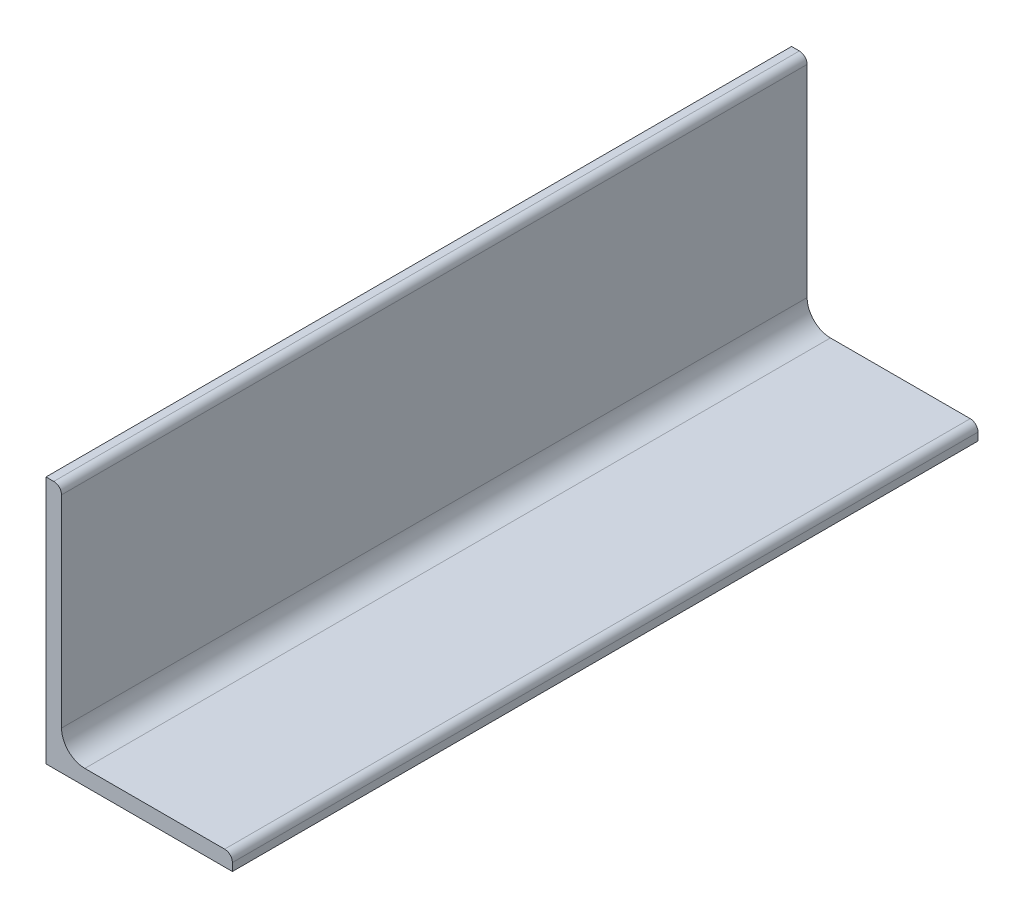
ISO-10303-21;
HEADER;
FILE_DESCRIPTION(('STEP AP214'),'2;1');
FILE_NAME('part.step','',(''),(''),'','','');
FILE_SCHEMA(('AUTOMOTIVE_DESIGN { 1 0 10303 214 1 1 1 1 }'));
ENDSEC;
DATA;
#1=APPLICATION_CONTEXT('core data for automotive mechanical design processes');
#2=APPLICATION_PROTOCOL_DEFINITION('international standard','automotive_design',2000,#1);
#3=PRODUCT_CONTEXT('',#1,'mechanical');
#4=PRODUCT('Part','Part','',(#3));
#5=PRODUCT_RELATED_PRODUCT_CATEGORY('part','',(#4));
#6=PRODUCT_DEFINITION_FORMATION('','',#4);
#7=PRODUCT_DEFINITION_CONTEXT('part definition',#1,'design');
#8=PRODUCT_DEFINITION('design','',#6,#7);
#9=PRODUCT_DEFINITION_SHAPE('','',#8);
#10=(LENGTH_UNIT() NAMED_UNIT(*) SI_UNIT(.MILLI.,.METRE.));
#11=(NAMED_UNIT(*) PLANE_ANGLE_UNIT() SI_UNIT($,.RADIAN.));
#12=(NAMED_UNIT(*) SI_UNIT($,.STERADIAN.) SOLID_ANGLE_UNIT());
#13=UNCERTAINTY_MEASURE_WITH_UNIT(LENGTH_MEASURE(1.E-05),#10,'distance_accuracy_value','');
#14=(GEOMETRIC_REPRESENTATION_CONTEXT(3) GLOBAL_UNCERTAINTY_ASSIGNED_CONTEXT((#13)) GLOBAL_UNIT_ASSIGNED_CONTEXT((#10,
#11,#12)) REPRESENTATION_CONTEXT('',''));
#15=CARTESIAN_POINT('',(0.,0.,0.));
#16=DIRECTION('',(0.,0.,1.));
#17=DIRECTION('',(1.,0.,0.));
#18=AXIS2_PLACEMENT_3D('',#15,#16,#17);
#19=CARTESIAN_POINT('',(0.490776827053332,102.172018782971,304.8));
#20=DIRECTION('',(1.,0.,0.));
#21=DIRECTION('',(0.,0.,-1.));
#22=AXIS2_PLACEMENT_3D('',#19,#20,#21);
#23=PLANE('',#22);
#24=DIRECTION('',(0.,-1.,0.));
#25=VECTOR('',#24,1.);
#26=CARTESIAN_POINT('',(0.490776827053332,102.172018782971,0.));
#27=LINE('',#26,#25);
#28=CARTESIAN_POINT('',(0.490776827053332,102.172018782971,0.));
#29=VERTEX_POINT('',#28);
#30=CARTESIAN_POINT('',(0.490776827053332,0.572018782971054,0.));
#31=VERTEX_POINT('',#30);
#32=EDGE_CURVE('E135',#29,#31,#27,.T.);
#33=ORIENTED_EDGE('',*,*,#32,.T.);
#34=DIRECTION('',(0.,0.,-1.));
#35=VECTOR('',#34,1.);
#36=CARTESIAN_POINT('',(0.490776827053332,0.572018782971054,304.8));
#37=LINE('',#36,#35);
#38=CARTESIAN_POINT('',(0.490776827053332,0.572018782971054,304.8));
#39=VERTEX_POINT('',#38);
#40=EDGE_CURVE('E11',#39,#31,#37,.T.);
#41=ORIENTED_EDGE('',*,*,#40,.F.);
#42=DIRECTION('',(0.,-1.,0.));
#43=VECTOR('',#42,1.);
#44=CARTESIAN_POINT('',(0.490776827053332,102.172018782971,304.8));
#45=LINE('',#44,#43);
#46=CARTESIAN_POINT('',(0.490776827053332,102.172018782971,304.8));
#47=VERTEX_POINT('',#46);
#48=EDGE_CURVE('E151',#47,#39,#45,.T.);
#49=ORIENTED_EDGE('',*,*,#48,.F.);
#50=DIRECTION('',(0.,0.,-1.));
#51=VECTOR('',#50,1.);
#52=CARTESIAN_POINT('',(0.490776827053332,102.172018782971,304.8));
#53=LINE('',#52,#51);
#54=EDGE_CURVE('E131',#47,#29,#53,.T.);
#55=ORIENTED_EDGE('',*,*,#54,.T.);
#56=EDGE_LOOP('',(#33,#41,#49,#55));
#57=FACE_BOUND('',#56,.T.);
#58=ADVANCED_FACE('F33',(#57),#23,.F.);
#59=CARTESIAN_POINT('',(0.490776827053332,0.572018782971054,304.8));
#60=DIRECTION('',(0.,1.,0.));
#61=DIRECTION('',(0.,0.,1.));
#62=AXIS2_PLACEMENT_3D('',#59,#60,#61);
#63=PLANE('',#62);
#64=DIRECTION('',(1.,0.,0.));
#65=VECTOR('',#64,1.);
#66=CARTESIAN_POINT('',(0.490776827053332,0.572018782971054,0.));
#67=LINE('',#66,#65);
#68=CARTESIAN_POINT('',(76.6907768270533,0.572018782971054,0.));
#69=VERTEX_POINT('',#68);
#70=EDGE_CURVE('E138',#31,#69,#67,.T.);
#71=ORIENTED_EDGE('',*,*,#70,.T.);
#72=DIRECTION('',(0.,0.,-1.));
#73=VECTOR('',#72,1.);
#74=CARTESIAN_POINT('',(76.6907768270533,0.572018782971054,304.8));
#75=LINE('',#74,#73);
#76=CARTESIAN_POINT('',(76.6907768270533,0.572018782971054,304.8));
#77=VERTEX_POINT('',#76);
#78=EDGE_CURVE('E41',#77,#69,#75,.T.);
#79=ORIENTED_EDGE('',*,*,#78,.F.);
#80=DIRECTION('',(1.,0.,0.));
#81=VECTOR('',#80,1.);
#82=CARTESIAN_POINT('',(0.490776827053332,0.572018782971054,304.8));
#83=LINE('',#82,#81);
#84=EDGE_CURVE('E95',#39,#77,#83,.T.);
#85=ORIENTED_EDGE('',*,*,#84,.F.);
#86=ORIENTED_EDGE('',*,*,#40,.T.);
#87=EDGE_LOOP('',(#71,#79,#85,#86));
#88=FACE_BOUND('',#87,.T.);
#89=ADVANCED_FACE('F194',(#88),#63,.F.);
#90=CARTESIAN_POINT('',(76.6907768270533,0.572018782971054,304.8));
#91=DIRECTION('',(-1.,0.,0.));
#92=DIRECTION('',(0.,0.,1.));
#93=AXIS2_PLACEMENT_3D('',#90,#91,#92);
#94=PLANE('',#93);
#95=DIRECTION('',(0.,1.,0.));
#96=VECTOR('',#95,1.);
#97=CARTESIAN_POINT('',(76.6907768270533,0.572018782971054,0.));
#98=LINE('',#97,#96);
#99=CARTESIAN_POINT('',(76.6907768270533,3.74701878297105,0.));
#100=VERTEX_POINT('',#99);
#101=EDGE_CURVE('E140',#69,#100,#98,.T.);
#102=ORIENTED_EDGE('',*,*,#101,.T.);
#103=DIRECTION('',(0.,0.,-1.));
#104=VECTOR('',#103,1.);
#105=CARTESIAN_POINT('',(76.6907768270533,3.74701878297105,304.8));
#106=LINE('',#105,#104);
#107=CARTESIAN_POINT('',(76.6907768270533,3.74701878297105,304.8));
#108=VERTEX_POINT('',#107);
#109=EDGE_CURVE('E161',#108,#100,#106,.T.);
#110=ORIENTED_EDGE('',*,*,#109,.F.);
#111=DIRECTION('',(0.,1.,0.));
#112=VECTOR('',#111,1.);
#113=CARTESIAN_POINT('',(76.6907768270533,0.572018782971054,304.8));
#114=LINE('',#113,#112);
#115=EDGE_CURVE('E169',#77,#108,#114,.T.);
#116=ORIENTED_EDGE('',*,*,#115,.F.);
#117=ORIENTED_EDGE('',*,*,#78,.T.);
#118=EDGE_LOOP('',(#102,#110,#116,#117));
#119=FACE_BOUND('',#118,.T.);
#120=ADVANCED_FACE('F167',(#119),#94,.F.);
#121=CARTESIAN_POINT('',(73.5157768270533,3.74701878297105,304.8));
#122=DIRECTION('',(0.,0.,-1.));
#123=DIRECTION('',(-1.,0.,0.));
#124=AXIS2_PLACEMENT_3D('',#121,#122,#123);
#125=CYLINDRICAL_SURFACE('',#124,3.175);
#126=CARTESIAN_POINT('',(73.5157768270533,3.74701878297105,0.));
#127=DIRECTION('',(0.,0.,1.));
#128=DIRECTION('',(1.,0.,0.));
#129=AXIS2_PLACEMENT_3D('',#126,#127,#128);
#130=CIRCLE('',#129,3.175);
#131=CARTESIAN_POINT('',(73.5157768270533,6.92201878297105,0.));
#132=VERTEX_POINT('',#131);
#133=EDGE_CURVE('E142',#100,#132,#130,.T.);
#134=ORIENTED_EDGE('',*,*,#133,.T.);
#135=DIRECTION('',(0.,0.,-1.));
#136=VECTOR('',#135,1.);
#137=CARTESIAN_POINT('',(73.5157768270533,6.92201878297105,304.8));
#138=LINE('',#137,#136);
#139=CARTESIAN_POINT('',(73.5157768270533,6.92201878297105,304.8));
#140=VERTEX_POINT('',#139);
#141=EDGE_CURVE('E158',#140,#132,#138,.T.);
#142=ORIENTED_EDGE('',*,*,#141,.F.);
#143=CARTESIAN_POINT('',(73.5157768270533,3.74701878297105,304.8));
#144=DIRECTION('',(0.,0.,1.));
#145=DIRECTION('',(1.,0.,0.));
#146=AXIS2_PLACEMENT_3D('',#143,#144,#145);
#147=CIRCLE('',#146,3.175);
#148=EDGE_CURVE('E185',#108,#140,#147,.T.);
#149=ORIENTED_EDGE('',*,*,#148,.F.);
#150=ORIENTED_EDGE('',*,*,#109,.T.);
#151=EDGE_LOOP('',(#134,#142,#149,#150));
#152=FACE_BOUND('',#151,.T.);
#153=ADVANCED_FACE('F178',(#152),#125,.T.);
#154=CARTESIAN_POINT('',(73.5157768270533,6.92201878297105,304.8));
#155=DIRECTION('',(0.,-1.,0.));
#156=DIRECTION('',(0.,0.,-1.));
#157=AXIS2_PLACEMENT_3D('',#154,#155,#156);
#158=PLANE('',#157);
#159=DIRECTION('',(-1.,0.,0.));
#160=VECTOR('',#159,1.);
#161=CARTESIAN_POINT('',(73.5157768270533,6.92201878297105,0.));
#162=LINE('',#161,#160);
#163=CARTESIAN_POINT('',(16.3657768270533,6.92201878297105,0.));
#164=VERTEX_POINT('',#163);
#165=EDGE_CURVE('E144',#132,#164,#162,.T.);
#166=ORIENTED_EDGE('',*,*,#165,.T.);
#167=DIRECTION('',(0.,0.,-1.));
#168=VECTOR('',#167,1.);
#169=CARTESIAN_POINT('',(16.3657768270533,6.92201878297105,304.8));
#170=LINE('',#169,#168);
#171=CARTESIAN_POINT('',(16.3657768270533,6.92201878297105,304.8));
#172=VERTEX_POINT('',#171);
#173=EDGE_CURVE('E155',#172,#164,#170,.T.);
#174=ORIENTED_EDGE('',*,*,#173,.F.);
#175=DIRECTION('',(-1.,0.,0.));
#176=VECTOR('',#175,1.);
#177=CARTESIAN_POINT('',(73.5157768270533,6.92201878297105,304.8));
#178=LINE('',#177,#176);
#179=EDGE_CURVE('E184',#140,#172,#178,.T.);
#180=ORIENTED_EDGE('',*,*,#179,.F.);
#181=ORIENTED_EDGE('',*,*,#141,.T.);
#182=EDGE_LOOP('',(#166,#174,#180,#181));
#183=FACE_BOUND('',#182,.T.);
#184=ADVANCED_FACE('F182',(#183),#158,.F.);
#185=CARTESIAN_POINT('',(16.3657768270533,16.447018782971,304.8));
#186=DIRECTION('',(0.,0.,-1.));
#187=DIRECTION('',(-1.,0.,0.));
#188=AXIS2_PLACEMENT_3D('',#185,#186,#187);
#189=CYLINDRICAL_SURFACE('',#188,9.52499999999999);
#190=CARTESIAN_POINT('',(16.3657768270533,16.447018782971,0.));
#191=DIRECTION('',(0.,0.,-1.));
#192=DIRECTION('',(1.,0.,0.));
#193=AXIS2_PLACEMENT_3D('',#190,#191,#192);
#194=CIRCLE('',#193,9.52499999999999);
#195=CARTESIAN_POINT('',(6.84077682705333,16.4470187829711,0.));
#196=VERTEX_POINT('',#195);
#197=EDGE_CURVE('E146',#164,#196,#194,.T.);
#198=ORIENTED_EDGE('',*,*,#197,.T.);
#199=DIRECTION('',(0.,0.,-1.));
#200=VECTOR('',#199,1.);
#201=CARTESIAN_POINT('',(6.84077682705333,16.4470187829711,304.8));
#202=LINE('',#201,#200);
#203=CARTESIAN_POINT('',(6.84077682705333,16.4470187829711,304.8));
#204=VERTEX_POINT('',#203);
#205=EDGE_CURVE('E126',#204,#196,#202,.T.);
#206=ORIENTED_EDGE('',*,*,#205,.F.);
#207=CARTESIAN_POINT('',(16.3657768270533,16.447018782971,304.8));
#208=DIRECTION('',(0.,0.,-1.));
#209=DIRECTION('',(1.,0.,0.));
#210=AXIS2_PLACEMENT_3D('',#207,#208,#209);
#211=CIRCLE('',#210,9.52499999999999);
#212=EDGE_CURVE('E117',#172,#204,#211,.T.);
#213=ORIENTED_EDGE('',*,*,#212,.F.);
#214=ORIENTED_EDGE('',*,*,#173,.T.);
#215=EDGE_LOOP('',(#198,#206,#213,#214));
#216=FACE_BOUND('',#215,.T.);
#217=ADVANCED_FACE('F206',(#216),#189,.F.);
#218=CARTESIAN_POINT('',(6.84077682705333,16.4470187829711,304.8));
#219=DIRECTION('',(-1.,0.,0.));
#220=DIRECTION('',(0.,0.,1.));
#221=AXIS2_PLACEMENT_3D('',#218,#219,#220);
#222=PLANE('',#221);
#223=DIRECTION('',(0.,1.,0.));
#224=VECTOR('',#223,1.);
#225=CARTESIAN_POINT('',(6.84077682705333,16.4470187829711,0.));
#226=LINE('',#225,#224);
#227=CARTESIAN_POINT('',(6.84077682705333,98.9970187829711,0.));
#228=VERTEX_POINT('',#227);
#229=EDGE_CURVE('E125',#196,#228,#226,.T.);
#230=ORIENTED_EDGE('',*,*,#229,.T.);
#231=DIRECTION('',(0.,0.,-1.));
#232=VECTOR('',#231,1.);
#233=CARTESIAN_POINT('',(6.84077682705333,98.9970187829711,304.8));
#234=LINE('',#233,#232);
#235=CARTESIAN_POINT('',(6.84077682705333,98.9970187829711,304.8));
#236=VERTEX_POINT('',#235);
#237=EDGE_CURVE('E122',#236,#228,#234,.T.);
#238=ORIENTED_EDGE('',*,*,#237,.F.);
#239=DIRECTION('',(0.,1.,0.));
#240=VECTOR('',#239,1.);
#241=CARTESIAN_POINT('',(6.84077682705333,16.4470187829711,304.8));
#242=LINE('',#241,#240);
#243=EDGE_CURVE('E111',#204,#236,#242,.T.);
#244=ORIENTED_EDGE('',*,*,#243,.F.);
#245=ORIENTED_EDGE('',*,*,#205,.T.);
#246=EDGE_LOOP('',(#230,#238,#244,#245));
#247=FACE_BOUND('',#246,.T.);
#248=ADVANCED_FACE('F123',(#247),#222,.F.);
#249=CARTESIAN_POINT('',(3.66577682705334,98.997018782971,304.8));
#250=DIRECTION('',(0.,0.,-1.));
#251=DIRECTION('',(-1.,0.,0.));
#252=AXIS2_PLACEMENT_3D('',#249,#250,#251);
#253=CYLINDRICAL_SURFACE('',#252,3.175);
#254=CARTESIAN_POINT('',(3.66577682705334,98.997018782971,0.));
#255=DIRECTION('',(0.,0.,1.));
#256=DIRECTION('',(1.,0.,0.));
#257=AXIS2_PLACEMENT_3D('',#254,#255,#256);
#258=CIRCLE('',#257,3.175);
#259=CARTESIAN_POINT('',(3.66577682705333,102.172018782971,0.));
#260=VERTEX_POINT('',#259);
#261=EDGE_CURVE('E81',#228,#260,#258,.T.);
#262=ORIENTED_EDGE('',*,*,#261,.T.);
#263=DIRECTION('',(0.,0.,-1.));
#264=VECTOR('',#263,1.);
#265=CARTESIAN_POINT('',(3.66577682705333,102.172018782971,304.8));
#266=LINE('',#265,#264);
#267=CARTESIAN_POINT('',(3.66577682705333,102.172018782971,304.8));
#268=VERTEX_POINT('',#267);
#269=EDGE_CURVE('E127',#268,#260,#266,.T.);
#270=ORIENTED_EDGE('',*,*,#269,.F.);
#271=CARTESIAN_POINT('',(3.66577682705334,98.997018782971,304.8));
#272=DIRECTION('',(0.,0.,1.));
#273=DIRECTION('',(1.,0.,0.));
#274=AXIS2_PLACEMENT_3D('',#271,#272,#273);
#275=CIRCLE('',#274,3.175);
#276=EDGE_CURVE('E115',#236,#268,#275,.T.);
#277=ORIENTED_EDGE('',*,*,#276,.F.);
#278=ORIENTED_EDGE('',*,*,#237,.T.);
#279=EDGE_LOOP('',(#262,#270,#277,#278));
#280=FACE_BOUND('',#279,.T.);
#281=ADVANCED_FACE('F129',(#280),#253,.T.);
#282=CARTESIAN_POINT('',(3.66577682705333,102.172018782971,304.8));
#283=DIRECTION('',(0.,-1.,0.));
#284=DIRECTION('',(0.,0.,-1.));
#285=AXIS2_PLACEMENT_3D('',#282,#283,#284);
#286=PLANE('',#285);
#287=DIRECTION('',(-1.,0.,0.));
#288=VECTOR('',#287,1.);
#289=CARTESIAN_POINT('',(3.66577682705333,102.172018782971,0.));
#290=LINE('',#289,#288);
#291=EDGE_CURVE('E87',#260,#29,#290,.T.);
#292=ORIENTED_EDGE('',*,*,#291,.T.);
#293=ORIENTED_EDGE('',*,*,#54,.F.);
#294=DIRECTION('',(-1.,0.,0.));
#295=VECTOR('',#294,1.);
#296=CARTESIAN_POINT('',(3.66577682705333,102.172018782971,304.8));
#297=LINE('',#296,#295);
#298=EDGE_CURVE('E49',#268,#47,#297,.T.);
#299=ORIENTED_EDGE('',*,*,#298,.F.);
#300=ORIENTED_EDGE('',*,*,#269,.T.);
#301=EDGE_LOOP('',(#292,#293,#299,#300));
#302=FACE_BOUND('',#301,.T.);
#303=ADVANCED_FACE('F214',(#302),#286,.F.);
#304=CARTESIAN_POINT('',(73.5157768270533,3.74701878297105,304.8));
#305=DIRECTION('',(0.,0.,1.));
#306=DIRECTION('',(1.,0.,0.));
#307=AXIS2_PLACEMENT_3D('',#304,#305,#306);
#308=PLANE('',#307);
#309=ORIENTED_EDGE('',*,*,#48,.T.);
#310=ORIENTED_EDGE('',*,*,#84,.T.);
#311=ORIENTED_EDGE('',*,*,#115,.T.);
#312=ORIENTED_EDGE('',*,*,#148,.T.);
#313=ORIENTED_EDGE('',*,*,#179,.T.);
#314=ORIENTED_EDGE('',*,*,#212,.T.);
#315=ORIENTED_EDGE('',*,*,#243,.T.);
#316=ORIENTED_EDGE('',*,*,#276,.T.);
#317=ORIENTED_EDGE('',*,*,#298,.T.);
#318=EDGE_LOOP('',(#309,#310,#311,#312,#313,#314,#315,#316,#317));
#319=FACE_BOUND('',#318,.T.);
#320=ADVANCED_FACE('F113',(#319),#308,.T.);
#321=CARTESIAN_POINT('',(73.5157768270533,3.74701878297105,0.));
#322=DIRECTION('',(0.,0.,1.));
#323=DIRECTION('',(1.,0.,0.));
#324=AXIS2_PLACEMENT_3D('',#321,#322,#323);
#325=PLANE('',#324);
#326=ORIENTED_EDGE('',*,*,#32,.F.);
#327=ORIENTED_EDGE('',*,*,#291,.F.);
#328=ORIENTED_EDGE('',*,*,#261,.F.);
#329=ORIENTED_EDGE('',*,*,#229,.F.);
#330=ORIENTED_EDGE('',*,*,#197,.F.);
#331=ORIENTED_EDGE('',*,*,#165,.F.);
#332=ORIENTED_EDGE('',*,*,#133,.F.);
#333=ORIENTED_EDGE('',*,*,#101,.F.);
#334=ORIENTED_EDGE('',*,*,#70,.F.);
#335=EDGE_LOOP('',(#326,#327,#328,#329,#330,#331,#332,#333,#334));
#336=FACE_BOUND('',#335,.T.);
#337=ADVANCED_FACE('F173',(#336),#325,.F.);
#338=CLOSED_SHELL('',(#58,#89,#120,#153,#184,#217,#248,#281,#303,#320,#337));
#339=MANIFOLD_SOLID_BREP('B2',#338);
#340=ADVANCED_BREP_SHAPE_REPRESENTATION('',(#18,#339),#14);
#341=SHAPE_DEFINITION_REPRESENTATION(#9,#340);
ENDSEC;
END-ISO-10303-21;
